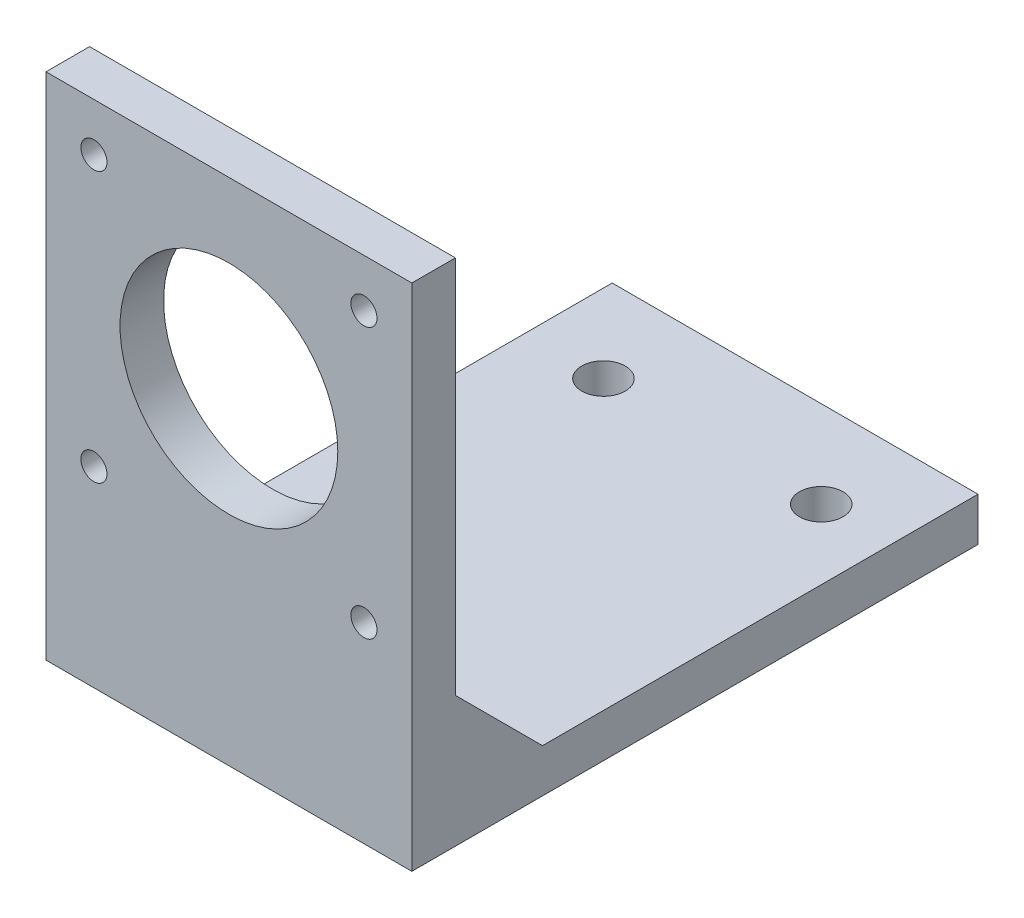
ISO-10303-21;
HEADER;
FILE_DESCRIPTION(('STEP AP214'),'2;1');
FILE_NAME('part.step','',(''),(''),'','','');
FILE_SCHEMA(('AUTOMOTIVE_DESIGN { 1 0 10303 214 1 1 1 1 }'));
ENDSEC;
DATA;
#1=APPLICATION_CONTEXT('core data for automotive mechanical design processes');
#2=APPLICATION_PROTOCOL_DEFINITION('international standard','automotive_design',2000,#1);
#3=PRODUCT_CONTEXT('',#1,'mechanical');
#4=PRODUCT('Part','Part','',(#3));
#5=PRODUCT_RELATED_PRODUCT_CATEGORY('part','',(#4));
#6=PRODUCT_DEFINITION_FORMATION('','',#4);
#7=PRODUCT_DEFINITION_CONTEXT('part definition',#1,'design');
#8=PRODUCT_DEFINITION('design','',#6,#7);
#9=PRODUCT_DEFINITION_SHAPE('','',#8);
#10=(LENGTH_UNIT() NAMED_UNIT(*) SI_UNIT(.MILLI.,.METRE.));
#11=(NAMED_UNIT(*) PLANE_ANGLE_UNIT() SI_UNIT($,.RADIAN.));
#12=(NAMED_UNIT(*) SI_UNIT($,.STERADIAN.) SOLID_ANGLE_UNIT());
#13=UNCERTAINTY_MEASURE_WITH_UNIT(LENGTH_MEASURE(1.E-05),#10,'distance_accuracy_value','');
#14=(GEOMETRIC_REPRESENTATION_CONTEXT(3) GLOBAL_UNCERTAINTY_ASSIGNED_CONTEXT((#13)) GLOBAL_UNIT_ASSIGNED_CONTEXT((#10,
#11,#12)) REPRESENTATION_CONTEXT('',''));
#15=CARTESIAN_POINT('',(0.,0.,0.));
#16=DIRECTION('',(0.,0.,1.));
#17=DIRECTION('',(1.,0.,0.));
#18=AXIS2_PLACEMENT_3D('',#15,#16,#17);
#19=CARTESIAN_POINT('',(0.,5.,0.));
#20=DIRECTION('',(0.,1.,0.));
#21=DIRECTION('',(0.,0.,1.));
#22=AXIS2_PLACEMENT_3D('',#19,#20,#21);
#23=PLANE('',#22);
#24=DIRECTION('',(1.,0.,0.));
#25=VECTOR('',#24,1.);
#26=CARTESIAN_POINT('',(-42.,5.,50.));
#27=LINE('',#26,#25);
#28=CARTESIAN_POINT('',(-42.,5.,50.));
#29=VERTEX_POINT('',#28);
#30=CARTESIAN_POINT('',(-37.,5.,50.));
#31=VERTEX_POINT('',#30);
#32=EDGE_CURVE('E55',#29,#31,#27,.T.);
#33=ORIENTED_EDGE('',*,*,#32,.T.);
#34=DIRECTION('',(0.,0.,-1.));
#35=VECTOR('',#34,1.);
#36=CARTESIAN_POINT('',(-37.,5.,60.));
#37=LINE('',#36,#35);
#38=CARTESIAN_POINT('',(-37.,5.,60.));
#39=VERTEX_POINT('',#38);
#40=EDGE_CURVE('E129',#39,#31,#37,.T.);
#41=ORIENTED_EDGE('',*,*,#40,.F.);
#42=DIRECTION('',(1.,0.,0.));
#43=VECTOR('',#42,1.);
#44=CARTESIAN_POINT('',(0.,5.,60.));
#45=LINE('',#44,#43);
#46=CARTESIAN_POINT('',(-5.,5.,60.));
#47=VERTEX_POINT('',#46);
#48=EDGE_CURVE('E115',#39,#47,#45,.T.);
#49=ORIENTED_EDGE('',*,*,#48,.T.);
#50=DIRECTION('',(0.,0.,-1.));
#51=VECTOR('',#50,1.);
#52=CARTESIAN_POINT('',(-5.,5.,60.));
#53=LINE('',#52,#51);
#54=CARTESIAN_POINT('',(-5.,5.,50.));
#55=VERTEX_POINT('',#54);
#56=EDGE_CURVE('E156',#47,#55,#53,.T.);
#57=ORIENTED_EDGE('',*,*,#56,.T.);
#58=DIRECTION('',(1.,0.,0.));
#59=VECTOR('',#58,1.);
#60=CARTESIAN_POINT('',(-5.,5.,50.));
#61=LINE('',#60,#59);
#62=CARTESIAN_POINT('',(0.,5.,50.));
#63=VERTEX_POINT('',#62);
#64=EDGE_CURVE('E162',#55,#63,#61,.T.);
#65=ORIENTED_EDGE('',*,*,#64,.T.);
#66=DIRECTION('',(0.,0.,-1.));
#67=VECTOR('',#66,1.);
#68=CARTESIAN_POINT('',(0.,5.,0.));
#69=LINE('',#68,#67);
#70=CARTESIAN_POINT('',(0.,5.,0.));
#71=VERTEX_POINT('',#70);
#72=EDGE_CURVE('E126',#63,#71,#69,.T.);
#73=ORIENTED_EDGE('',*,*,#72,.T.);
#74=DIRECTION('',(-1.,0.,0.));
#75=VECTOR('',#74,1.);
#76=CARTESIAN_POINT('',(0.,5.,0.));
#77=LINE('',#76,#75);
#78=CARTESIAN_POINT('',(-42.,5.,0.));
#79=VERTEX_POINT('',#78);
#80=EDGE_CURVE('E258',#71,#79,#77,.T.);
#81=ORIENTED_EDGE('',*,*,#80,.T.);
#82=DIRECTION('',(0.,0.,1.));
#83=VECTOR('',#82,1.);
#84=CARTESIAN_POINT('',(-42.,5.,0.));
#85=LINE('',#84,#83);
#86=EDGE_CURVE('E60',#79,#29,#85,.T.);
#87=ORIENTED_EDGE('',*,*,#86,.T.);
#88=EDGE_LOOP('',(#33,#41,#49,#57,#65,#73,#81,#87));
#89=FACE_BOUND('',#88,.T.);
#90=CARTESIAN_POINT('',(-33.,5.,10.));
#91=DIRECTION('',(0.,1.,0.));
#92=DIRECTION('',(0.,0.,1.));
#93=AXIS2_PLACEMENT_3D('',#90,#91,#92);
#94=CIRCLE('',#93,2.5);
#95=CARTESIAN_POINT('',(-33.,5.,12.5));
#96=VERTEX_POINT('',#95);
#97=EDGE_CURVE('E250',#96,#96,#94,.T.);
#98=ORIENTED_EDGE('',*,*,#97,.F.);
#99=EDGE_LOOP('',(#98));
#100=FACE_BOUND('',#99,.T.);
#101=CARTESIAN_POINT('',(-8.,5.,10.));
#102=DIRECTION('',(0.,1.,0.));
#103=DIRECTION('',(0.,0.,1.));
#104=AXIS2_PLACEMENT_3D('',#101,#102,#103);
#105=CIRCLE('',#104,2.5);
#106=CARTESIAN_POINT('',(-8.,5.,12.5));
#107=VERTEX_POINT('',#106);
#108=EDGE_CURVE('E242',#107,#107,#105,.T.);
#109=ORIENTED_EDGE('',*,*,#108,.F.);
#110=EDGE_LOOP('',(#109));
#111=FACE_BOUND('',#110,.T.);
#112=ADVANCED_FACE('F39',(#89,#100,#111),#23,.T.);
#113=CARTESIAN_POINT('',(0.,0.,0.));
#114=DIRECTION('',(0.,1.,0.));
#115=DIRECTION('',(0.,0.,1.));
#116=AXIS2_PLACEMENT_3D('',#113,#114,#115);
#117=PLANE('',#116);
#118=DIRECTION('',(-1.,0.,0.));
#119=VECTOR('',#118,1.);
#120=CARTESIAN_POINT('',(0.,0.,0.));
#121=LINE('',#120,#119);
#122=CARTESIAN_POINT('',(0.,0.,0.));
#123=VERTEX_POINT('',#122);
#124=CARTESIAN_POINT('',(-42.,0.,0.));
#125=VERTEX_POINT('',#124);
#126=EDGE_CURVE('E254',#123,#125,#121,.T.);
#127=ORIENTED_EDGE('',*,*,#126,.F.);
#128=DIRECTION('',(0.,0.,-1.));
#129=VECTOR('',#128,1.);
#130=CARTESIAN_POINT('',(0.,0.,0.));
#131=LINE('',#130,#129);
#132=CARTESIAN_POINT('',(0.,0.,65.));
#133=VERTEX_POINT('',#132);
#134=EDGE_CURVE('E261',#133,#123,#131,.T.);
#135=ORIENTED_EDGE('',*,*,#134,.F.);
#136=DIRECTION('',(1.,0.,0.));
#137=VECTOR('',#136,1.);
#138=CARTESIAN_POINT('',(-42.,0.,65.));
#139=LINE('',#138,#137);
#140=CARTESIAN_POINT('',(-42.,0.,65.));
#141=VERTEX_POINT('',#140);
#142=EDGE_CURVE('E214',#141,#133,#139,.T.);
#143=ORIENTED_EDGE('',*,*,#142,.F.);
#144=DIRECTION('',(0.,0.,1.));
#145=VECTOR('',#144,1.);
#146=CARTESIAN_POINT('',(-42.,0.,0.));
#147=LINE('',#146,#145);
#148=EDGE_CURVE('E269',#125,#141,#147,.T.);
#149=ORIENTED_EDGE('',*,*,#148,.F.);
#150=EDGE_LOOP('',(#127,#135,#143,#149));
#151=FACE_BOUND('',#150,.T.);
#152=CARTESIAN_POINT('',(-33.,0.,10.));
#153=DIRECTION('',(0.,1.,0.));
#154=DIRECTION('',(0.,0.,1.));
#155=AXIS2_PLACEMENT_3D('',#152,#153,#154);
#156=CIRCLE('',#155,2.5);
#157=CARTESIAN_POINT('',(-33.,0.,12.5));
#158=VERTEX_POINT('',#157);
#159=EDGE_CURVE('E246',#158,#158,#156,.T.);
#160=ORIENTED_EDGE('',*,*,#159,.T.);
#161=EDGE_LOOP('',(#160));
#162=FACE_BOUND('',#161,.T.);
#163=CARTESIAN_POINT('',(-8.,0.,10.));
#164=DIRECTION('',(0.,1.,0.));
#165=DIRECTION('',(0.,0.,1.));
#166=AXIS2_PLACEMENT_3D('',#163,#164,#165);
#167=CIRCLE('',#166,2.5);
#168=CARTESIAN_POINT('',(-8.,0.,12.5));
#169=VERTEX_POINT('',#168);
#170=EDGE_CURVE('E241',#169,#169,#167,.T.);
#171=ORIENTED_EDGE('',*,*,#170,.T.);
#172=EDGE_LOOP('',(#171));
#173=FACE_BOUND('',#172,.T.);
#174=ADVANCED_FACE('F283',(#151,#162,#173),#117,.F.);
#175=CARTESIAN_POINT('',(0.,5.,0.));
#176=DIRECTION('',(0.,0.,1.));
#177=DIRECTION('',(1.,0.,0.));
#178=AXIS2_PLACEMENT_3D('',#175,#176,#177);
#179=PLANE('',#178);
#180=ORIENTED_EDGE('',*,*,#126,.T.);
#181=DIRECTION('',(0.,-1.,0.));
#182=VECTOR('',#181,1.);
#183=CARTESIAN_POINT('',(-42.,5.,0.));
#184=LINE('',#183,#182);
#185=EDGE_CURVE('E11',#79,#125,#184,.T.);
#186=ORIENTED_EDGE('',*,*,#185,.F.);
#187=ORIENTED_EDGE('',*,*,#80,.F.);
#188=DIRECTION('',(0.,-1.,0.));
#189=VECTOR('',#188,1.);
#190=CARTESIAN_POINT('',(0.,5.,0.));
#191=LINE('',#190,#189);
#192=EDGE_CURVE('E48',#71,#123,#191,.T.);
#193=ORIENTED_EDGE('',*,*,#192,.T.);
#194=EDGE_LOOP('',(#180,#186,#187,#193));
#195=FACE_BOUND('',#194,.T.);
#196=ADVANCED_FACE('F41',(#195),#179,.F.);
#197=CARTESIAN_POINT('',(-42.,5.,0.));
#198=DIRECTION('',(1.,0.,0.));
#199=DIRECTION('',(0.,0.,-1.));
#200=AXIS2_PLACEMENT_3D('',#197,#198,#199);
#201=PLANE('',#200);
#202=DIRECTION('',(0.,0.707106781186548,0.707106781186547));
#203=VECTOR('',#202,1.);
#204=CARTESIAN_POINT('',(-42.,5.,50.));
#205=LINE('',#204,#203);
#206=CARTESIAN_POINT('',(-42.,15.,60.));
#207=VERTEX_POINT('',#206);
#208=EDGE_CURVE('E134',#29,#207,#205,.T.);
#209=ORIENTED_EDGE('',*,*,#208,.F.);
#210=ORIENTED_EDGE('',*,*,#86,.F.);
#211=ORIENTED_EDGE('',*,*,#185,.T.);
#212=ORIENTED_EDGE('',*,*,#148,.T.);
#213=DIRECTION('',(0.,-1.,0.));
#214=VECTOR('',#213,1.);
#215=CARTESIAN_POINT('',(-42.,0.,65.));
#216=LINE('',#215,#214);
#217=CARTESIAN_POINT('',(-42.,58.5,65.));
#218=VERTEX_POINT('',#217);
#219=EDGE_CURVE('E210',#218,#141,#216,.T.);
#220=ORIENTED_EDGE('',*,*,#219,.F.);
#221=DIRECTION('',(0.,0.,-1.));
#222=VECTOR('',#221,1.);
#223=CARTESIAN_POINT('',(-42.,58.5,65.));
#224=LINE('',#223,#222);
#225=CARTESIAN_POINT('',(-42.,58.5,60.));
#226=VERTEX_POINT('',#225);
#227=EDGE_CURVE('E225',#218,#226,#224,.T.);
#228=ORIENTED_EDGE('',*,*,#227,.T.);
#229=DIRECTION('',(0.,-1.,0.));
#230=VECTOR('',#229,1.);
#231=CARTESIAN_POINT('',(-42.,0.,60.));
#232=LINE('',#231,#230);
#233=EDGE_CURVE('E206',#226,#207,#232,.T.);
#234=ORIENTED_EDGE('',*,*,#233,.T.);
#235=EDGE_LOOP('',(#209,#210,#211,#212,#220,#228,#234));
#236=FACE_BOUND('',#235,.T.);
#237=ADVANCED_FACE('F289',(#236),#201,.F.);
#238=CARTESIAN_POINT('',(0.,5.,0.));
#239=DIRECTION('',(-1.,0.,0.));
#240=DIRECTION('',(0.,0.,1.));
#241=AXIS2_PLACEMENT_3D('',#238,#239,#240);
#242=PLANE('',#241);
#243=ORIENTED_EDGE('',*,*,#72,.F.);
#244=DIRECTION('',(0.,0.707106781186548,0.707106781186547));
#245=VECTOR('',#244,1.);
#246=CARTESIAN_POINT('',(0.,5.,50.));
#247=LINE('',#246,#245);
#248=CARTESIAN_POINT('',(0.,15.,60.));
#249=VERTEX_POINT('',#248);
#250=EDGE_CURVE('E146',#63,#249,#247,.T.);
#251=ORIENTED_EDGE('',*,*,#250,.T.);
#252=DIRECTION('',(0.,1.,0.));
#253=VECTOR('',#252,1.);
#254=CARTESIAN_POINT('',(0.,0.,60.));
#255=LINE('',#254,#253);
#256=CARTESIAN_POINT('',(0.,58.5,60.));
#257=VERTEX_POINT('',#256);
#258=EDGE_CURVE('E229',#249,#257,#255,.T.);
#259=ORIENTED_EDGE('',*,*,#258,.T.);
#260=DIRECTION('',(0.,0.,-1.));
#261=VECTOR('',#260,1.);
#262=CARTESIAN_POINT('',(0.,58.5,65.));
#263=LINE('',#262,#261);
#264=CARTESIAN_POINT('',(0.,58.5,65.));
#265=VERTEX_POINT('',#264);
#266=EDGE_CURVE('E237',#265,#257,#263,.T.);
#267=ORIENTED_EDGE('',*,*,#266,.F.);
#268=DIRECTION('',(0.,1.,0.));
#269=VECTOR('',#268,1.);
#270=CARTESIAN_POINT('',(0.,0.,65.));
#271=LINE('',#270,#269);
#272=EDGE_CURVE('E219',#133,#265,#271,.T.);
#273=ORIENTED_EDGE('',*,*,#272,.F.);
#274=ORIENTED_EDGE('',*,*,#134,.T.);
#275=ORIENTED_EDGE('',*,*,#192,.F.);
#276=EDGE_LOOP('',(#243,#251,#259,#267,#273,#274,#275));
#277=FACE_BOUND('',#276,.T.);
#278=ADVANCED_FACE('F291',(#277),#242,.F.);
#279=CARTESIAN_POINT('',(-33.,5.,10.));
#280=DIRECTION('',(0.,-1.,0.));
#281=DIRECTION('',(0.,0.,-1.));
#282=AXIS2_PLACEMENT_3D('',#279,#280,#281);
#283=CYLINDRICAL_SURFACE('',#282,2.5);
#284=ORIENTED_EDGE('',*,*,#97,.T.);
#285=EDGE_LOOP('',(#284));
#286=FACE_BOUND('',#285,.T.);
#287=ORIENTED_EDGE('',*,*,#159,.F.);
#288=EDGE_LOOP('',(#287));
#289=FACE_BOUND('',#288,.T.);
#290=ADVANCED_FACE('F356',(#286,#289),#283,.F.);
#291=CARTESIAN_POINT('',(-8.,5.,10.));
#292=DIRECTION('',(0.,-1.,0.));
#293=DIRECTION('',(0.,0.,-1.));
#294=AXIS2_PLACEMENT_3D('',#291,#292,#293);
#295=CYLINDRICAL_SURFACE('',#294,2.5);
#296=ORIENTED_EDGE('',*,*,#108,.T.);
#297=EDGE_LOOP('',(#296));
#298=FACE_BOUND('',#297,.T.);
#299=ORIENTED_EDGE('',*,*,#170,.F.);
#300=EDGE_LOOP('',(#299));
#301=FACE_BOUND('',#300,.T.);
#302=ADVANCED_FACE('F327',(#298,#301),#295,.F.);
#303=CARTESIAN_POINT('',(0.,0.,60.));
#304=DIRECTION('',(0.,0.,-1.));
#305=DIRECTION('',(-1.,0.,0.));
#306=AXIS2_PLACEMENT_3D('',#303,#304,#305);
#307=PLANE('',#306);
#308=DIRECTION('',(1.,0.,0.));
#309=VECTOR('',#308,1.);
#310=CARTESIAN_POINT('',(-42.,15.,60.));
#311=LINE('',#310,#309);
#312=CARTESIAN_POINT('',(-37.,15.,60.));
#313=VERTEX_POINT('',#312);
#314=EDGE_CURVE('E147',#207,#313,#311,.T.);
#315=ORIENTED_EDGE('',*,*,#314,.F.);
#316=ORIENTED_EDGE('',*,*,#233,.F.);
#317=DIRECTION('',(-1.,0.,0.));
#318=VECTOR('',#317,1.);
#319=CARTESIAN_POINT('',(-42.,58.5,60.));
#320=LINE('',#319,#318);
#321=EDGE_CURVE('E215',#257,#226,#320,.T.);
#322=ORIENTED_EDGE('',*,*,#321,.F.);
#323=ORIENTED_EDGE('',*,*,#258,.F.);
#324=DIRECTION('',(1.,0.,0.));
#325=VECTOR('',#324,1.);
#326=CARTESIAN_POINT('',(-5.,15.,60.));
#327=LINE('',#326,#325);
#328=CARTESIAN_POINT('',(-5.,15.,60.));
#329=VERTEX_POINT('',#328);
#330=EDGE_CURVE('E159',#329,#249,#327,.T.);
#331=ORIENTED_EDGE('',*,*,#330,.F.);
#332=DIRECTION('',(0.,-1.,0.));
#333=VECTOR('',#332,1.);
#334=CARTESIAN_POINT('',(-5.,15.,60.));
#335=LINE('',#334,#333);
#336=EDGE_CURVE('E122',#329,#47,#335,.T.);
#337=ORIENTED_EDGE('',*,*,#336,.T.);
#338=ORIENTED_EDGE('',*,*,#48,.F.);
#339=DIRECTION('',(0.,-1.,0.));
#340=VECTOR('',#339,1.);
#341=CARTESIAN_POINT('',(-37.,15.,60.));
#342=LINE('',#341,#340);
#343=EDGE_CURVE('E119',#313,#39,#342,.T.);
#344=ORIENTED_EDGE('',*,*,#343,.F.);
#345=EDGE_LOOP('',(#315,#316,#322,#323,#331,#337,#338,#344));
#346=FACE_BOUND('',#345,.T.);
#347=CARTESIAN_POINT('',(-5.49999999999999,22.,60.));
#348=DIRECTION('',(0.,0.,1.));
#349=DIRECTION('',(1.,0.,0.));
#350=AXIS2_PLACEMENT_3D('',#347,#348,#349);
#351=CIRCLE('',#350,1.5);
#352=CARTESIAN_POINT('',(-3.99999999999999,22.,60.));
#353=VERTEX_POINT('',#352);
#354=EDGE_CURVE('E166',#353,#353,#351,.T.);
#355=ORIENTED_EDGE('',*,*,#354,.T.);
#356=EDGE_LOOP('',(#355));
#357=FACE_BOUND('',#356,.T.);
#358=CARTESIAN_POINT('',(-36.5,22.,60.));
#359=DIRECTION('',(0.,0.,1.));
#360=DIRECTION('',(1.,0.,0.));
#361=AXIS2_PLACEMENT_3D('',#358,#359,#360);
#362=CIRCLE('',#361,1.5);
#363=CARTESIAN_POINT('',(-35.,22.,60.));
#364=VERTEX_POINT('',#363);
#365=EDGE_CURVE('E182',#364,#364,#362,.T.);
#366=ORIENTED_EDGE('',*,*,#365,.T.);
#367=EDGE_LOOP('',(#366));
#368=FACE_BOUND('',#367,.T.);
#369=CARTESIAN_POINT('',(-21.,37.5,60.));
#370=DIRECTION('',(0.,0.,1.));
#371=DIRECTION('',(1.,0.,0.));
#372=AXIS2_PLACEMENT_3D('',#369,#370,#371);
#373=CIRCLE('',#372,12.5);
#374=CARTESIAN_POINT('',(-8.49999999999999,37.5,60.));
#375=VERTEX_POINT('',#374);
#376=EDGE_CURVE('E198',#375,#375,#373,.T.);
#377=ORIENTED_EDGE('',*,*,#376,.T.);
#378=EDGE_LOOP('',(#377));
#379=FACE_BOUND('',#378,.T.);
#380=CARTESIAN_POINT('',(-36.5,53.,60.));
#381=DIRECTION('',(0.,0.,1.));
#382=DIRECTION('',(1.,0.,0.));
#383=AXIS2_PLACEMENT_3D('',#380,#381,#382);
#384=CIRCLE('',#383,1.5);
#385=CARTESIAN_POINT('',(-35.,53.,60.));
#386=VERTEX_POINT('',#385);
#387=EDGE_CURVE('E190',#386,#386,#384,.T.);
#388=ORIENTED_EDGE('',*,*,#387,.T.);
#389=EDGE_LOOP('',(#388));
#390=FACE_BOUND('',#389,.T.);
#391=CARTESIAN_POINT('',(-5.49999999999999,53.,60.));
#392=DIRECTION('',(0.,0.,1.));
#393=DIRECTION('',(1.,0.,0.));
#394=AXIS2_PLACEMENT_3D('',#391,#392,#393);
#395=CIRCLE('',#394,1.5);
#396=CARTESIAN_POINT('',(-3.99999999999999,53.,60.));
#397=VERTEX_POINT('',#396);
#398=EDGE_CURVE('E174',#397,#397,#395,.T.);
#399=ORIENTED_EDGE('',*,*,#398,.T.);
#400=EDGE_LOOP('',(#399));
#401=FACE_BOUND('',#400,.T.);
#402=ADVANCED_FACE('F116',(#346,#357,#368,#379,#390,#401),#307,.T.);
#403=CARTESIAN_POINT('',(0.,0.,65.));
#404=DIRECTION('',(0.,0.,-1.));
#405=DIRECTION('',(-1.,0.,0.));
#406=AXIS2_PLACEMENT_3D('',#403,#404,#405);
#407=PLANE('',#406);
#408=ORIENTED_EDGE('',*,*,#219,.T.);
#409=ORIENTED_EDGE('',*,*,#142,.T.);
#410=ORIENTED_EDGE('',*,*,#272,.T.);
#411=DIRECTION('',(-1.,0.,0.));
#412=VECTOR('',#411,1.);
#413=CARTESIAN_POINT('',(-42.,58.5,65.));
#414=LINE('',#413,#412);
#415=EDGE_CURVE('E222',#265,#218,#414,.T.);
#416=ORIENTED_EDGE('',*,*,#415,.T.);
#417=EDGE_LOOP('',(#408,#409,#410,#416));
#418=FACE_BOUND('',#417,.T.);
#419=CARTESIAN_POINT('',(-21.,37.5,65.));
#420=DIRECTION('',(0.,0.,1.));
#421=DIRECTION('',(1.,0.,0.));
#422=AXIS2_PLACEMENT_3D('',#419,#420,#421);
#423=CIRCLE('',#422,12.5);
#424=CARTESIAN_POINT('',(-8.49999999999999,37.5,65.));
#425=VERTEX_POINT('',#424);
#426=EDGE_CURVE('E202',#425,#425,#423,.T.);
#427=ORIENTED_EDGE('',*,*,#426,.F.);
#428=EDGE_LOOP('',(#427));
#429=FACE_BOUND('',#428,.T.);
#430=CARTESIAN_POINT('',(-36.5,53.,65.));
#431=DIRECTION('',(0.,0.,1.));
#432=DIRECTION('',(1.,0.,0.));
#433=AXIS2_PLACEMENT_3D('',#430,#431,#432);
#434=CIRCLE('',#433,1.5);
#435=CARTESIAN_POINT('',(-35.,53.,65.));
#436=VERTEX_POINT('',#435);
#437=EDGE_CURVE('E194',#436,#436,#434,.T.);
#438=ORIENTED_EDGE('',*,*,#437,.F.);
#439=EDGE_LOOP('',(#438));
#440=FACE_BOUND('',#439,.T.);
#441=CARTESIAN_POINT('',(-36.5,22.,65.));
#442=DIRECTION('',(0.,0.,1.));
#443=DIRECTION('',(1.,0.,0.));
#444=AXIS2_PLACEMENT_3D('',#441,#442,#443);
#445=CIRCLE('',#444,1.5);
#446=CARTESIAN_POINT('',(-35.,22.,65.));
#447=VERTEX_POINT('',#446);
#448=EDGE_CURVE('E186',#447,#447,#445,.T.);
#449=ORIENTED_EDGE('',*,*,#448,.F.);
#450=EDGE_LOOP('',(#449));
#451=FACE_BOUND('',#450,.T.);
#452=CARTESIAN_POINT('',(-5.49999999999999,53.,65.));
#453=DIRECTION('',(0.,0.,1.));
#454=DIRECTION('',(1.,0.,0.));
#455=AXIS2_PLACEMENT_3D('',#452,#453,#454);
#456=CIRCLE('',#455,1.5);
#457=CARTESIAN_POINT('',(-3.99999999999999,53.,65.));
#458=VERTEX_POINT('',#457);
#459=EDGE_CURVE('E178',#458,#458,#456,.T.);
#460=ORIENTED_EDGE('',*,*,#459,.F.);
#461=EDGE_LOOP('',(#460));
#462=FACE_BOUND('',#461,.T.);
#463=CARTESIAN_POINT('',(-5.49999999999999,22.,65.));
#464=DIRECTION('',(0.,0.,1.));
#465=DIRECTION('',(1.,0.,0.));
#466=AXIS2_PLACEMENT_3D('',#463,#464,#465);
#467=CIRCLE('',#466,1.5);
#468=CARTESIAN_POINT('',(-3.99999999999999,22.,65.));
#469=VERTEX_POINT('',#468);
#470=EDGE_CURVE('E170',#469,#469,#467,.T.);
#471=ORIENTED_EDGE('',*,*,#470,.F.);
#472=EDGE_LOOP('',(#471));
#473=FACE_BOUND('',#472,.T.);
#474=ADVANCED_FACE('F304',(#418,#429,#440,#451,#462,#473),#407,.F.);
#475=CARTESIAN_POINT('',(-42.,58.5,65.));
#476=DIRECTION('',(0.,-1.,0.));
#477=DIRECTION('',(0.,0.,-1.));
#478=AXIS2_PLACEMENT_3D('',#475,#476,#477);
#479=PLANE('',#478);
#480=ORIENTED_EDGE('',*,*,#321,.T.);
#481=ORIENTED_EDGE('',*,*,#227,.F.);
#482=ORIENTED_EDGE('',*,*,#415,.F.);
#483=ORIENTED_EDGE('',*,*,#266,.T.);
#484=EDGE_LOOP('',(#480,#481,#482,#483));
#485=FACE_BOUND('',#484,.T.);
#486=ADVANCED_FACE('F301',(#485),#479,.F.);
#487=CARTESIAN_POINT('',(-21.,37.5,65.));
#488=DIRECTION('',(0.,0.,-1.));
#489=DIRECTION('',(-1.,0.,0.));
#490=AXIS2_PLACEMENT_3D('',#487,#488,#489);
#491=CYLINDRICAL_SURFACE('',#490,12.5);
#492=ORIENTED_EDGE('',*,*,#426,.T.);
#493=EDGE_LOOP('',(#492));
#494=FACE_BOUND('',#493,.T.);
#495=ORIENTED_EDGE('',*,*,#376,.F.);
#496=EDGE_LOOP('',(#495));
#497=FACE_BOUND('',#496,.T.);
#498=ADVANCED_FACE('F397',(#494,#497),#491,.F.);
#499=CARTESIAN_POINT('',(-36.5,53.,65.));
#500=DIRECTION('',(0.,0.,-1.));
#501=DIRECTION('',(-1.,0.,0.));
#502=AXIS2_PLACEMENT_3D('',#499,#500,#501);
#503=CYLINDRICAL_SURFACE('',#502,1.5);
#504=ORIENTED_EDGE('',*,*,#437,.T.);
#505=EDGE_LOOP('',(#504));
#506=FACE_BOUND('',#505,.T.);
#507=ORIENTED_EDGE('',*,*,#387,.F.);
#508=EDGE_LOOP('',(#507));
#509=FACE_BOUND('',#508,.T.);
#510=ADVANCED_FACE('F344',(#506,#509),#503,.F.);
#511=CARTESIAN_POINT('',(-36.5,22.,65.));
#512=DIRECTION('',(0.,0.,-1.));
#513=DIRECTION('',(-1.,0.,0.));
#514=AXIS2_PLACEMENT_3D('',#511,#512,#513);
#515=CYLINDRICAL_SURFACE('',#514,1.5);
#516=ORIENTED_EDGE('',*,*,#448,.T.);
#517=EDGE_LOOP('',(#516));
#518=FACE_BOUND('',#517,.T.);
#519=ORIENTED_EDGE('',*,*,#365,.F.);
#520=EDGE_LOOP('',(#519));
#521=FACE_BOUND('',#520,.T.);
#522=ADVANCED_FACE('F338',(#518,#521),#515,.F.);
#523=CARTESIAN_POINT('',(-5.49999999999999,53.,65.));
#524=DIRECTION('',(0.,0.,-1.));
#525=DIRECTION('',(-1.,0.,0.));
#526=AXIS2_PLACEMENT_3D('',#523,#524,#525);
#527=CYLINDRICAL_SURFACE('',#526,1.5);
#528=ORIENTED_EDGE('',*,*,#459,.T.);
#529=EDGE_LOOP('',(#528));
#530=FACE_BOUND('',#529,.T.);
#531=ORIENTED_EDGE('',*,*,#398,.F.);
#532=EDGE_LOOP('',(#531));
#533=FACE_BOUND('',#532,.T.);
#534=ADVANCED_FACE('F322',(#530,#533),#527,.F.);
#535=CARTESIAN_POINT('',(-5.49999999999999,22.,65.));
#536=DIRECTION('',(0.,0.,-1.));
#537=DIRECTION('',(-1.,0.,0.));
#538=AXIS2_PLACEMENT_3D('',#535,#536,#537);
#539=CYLINDRICAL_SURFACE('',#538,1.5);
#540=ORIENTED_EDGE('',*,*,#470,.T.);
#541=EDGE_LOOP('',(#540));
#542=FACE_BOUND('',#541,.T.);
#543=ORIENTED_EDGE('',*,*,#354,.F.);
#544=EDGE_LOOP('',(#543));
#545=FACE_BOUND('',#544,.T.);
#546=ADVANCED_FACE('F319',(#542,#545),#539,.F.);
#547=CARTESIAN_POINT('',(-5.,5.,50.));
#548=DIRECTION('',(0.,0.707106781186547,-0.707106781186548));
#549=DIRECTION('',(0.,0.707106781186548,0.707106781186547));
#550=AXIS2_PLACEMENT_3D('',#547,#548,#549);
#551=PLANE('',#550);
#552=ORIENTED_EDGE('',*,*,#250,.F.);
#553=ORIENTED_EDGE('',*,*,#64,.F.);
#554=DIRECTION('',(0.,0.707106781186548,0.707106781186547));
#555=VECTOR('',#554,1.);
#556=CARTESIAN_POINT('',(-5.,5.,50.));
#557=LINE('',#556,#555);
#558=EDGE_CURVE('E150',#55,#329,#557,.T.);
#559=ORIENTED_EDGE('',*,*,#558,.T.);
#560=ORIENTED_EDGE('',*,*,#330,.T.);
#561=EDGE_LOOP('',(#552,#553,#559,#560));
#562=FACE_BOUND('',#561,.T.);
#563=ADVANCED_FACE('F295',(#562),#551,.T.);
#564=CARTESIAN_POINT('',(-5.,0.,0.));
#565=DIRECTION('',(1.,0.,0.));
#566=DIRECTION('',(0.,0.,-1.));
#567=AXIS2_PLACEMENT_3D('',#564,#565,#566);
#568=PLANE('',#567);
#569=ORIENTED_EDGE('',*,*,#558,.F.);
#570=ORIENTED_EDGE('',*,*,#56,.F.);
#571=ORIENTED_EDGE('',*,*,#336,.F.);
#572=EDGE_LOOP('',(#569,#570,#571));
#573=FACE_BOUND('',#572,.T.);
#574=ADVANCED_FACE('F440',(#573),#568,.F.);
#575=CARTESIAN_POINT('',(-42.,5.,50.));
#576=DIRECTION('',(0.,0.707106781186547,-0.707106781186548));
#577=DIRECTION('',(0.,0.707106781186548,0.707106781186547));
#578=AXIS2_PLACEMENT_3D('',#575,#576,#577);
#579=PLANE('',#578);
#580=DIRECTION('',(0.,0.707106781186548,0.707106781186547));
#581=VECTOR('',#580,1.);
#582=CARTESIAN_POINT('',(-37.,5.,50.));
#583=LINE('',#582,#581);
#584=EDGE_CURVE('E137',#31,#313,#583,.T.);
#585=ORIENTED_EDGE('',*,*,#584,.F.);
#586=ORIENTED_EDGE('',*,*,#32,.F.);
#587=ORIENTED_EDGE('',*,*,#208,.T.);
#588=ORIENTED_EDGE('',*,*,#314,.T.);
#589=EDGE_LOOP('',(#585,#586,#587,#588));
#590=FACE_BOUND('',#589,.T.);
#591=ADVANCED_FACE('F448',(#590),#579,.T.);
#592=CARTESIAN_POINT('',(-37.,0.,0.));
#593=DIRECTION('',(1.,0.,0.));
#594=DIRECTION('',(0.,0.,-1.));
#595=AXIS2_PLACEMENT_3D('',#592,#593,#594);
#596=PLANE('',#595);
#597=ORIENTED_EDGE('',*,*,#584,.T.);
#598=ORIENTED_EDGE('',*,*,#343,.T.);
#599=ORIENTED_EDGE('',*,*,#40,.T.);
#600=EDGE_LOOP('',(#597,#598,#599));
#601=FACE_BOUND('',#600,.T.);
#602=ADVANCED_FACE('F136',(#601),#596,.T.);
#603=CLOSED_SHELL('',(#112,#174,#196,#237,#278,#290,#302,#402,#474,#486,#498,#510,#522,#534,
#546,#563,#574,#591,#602));
#604=MANIFOLD_SOLID_BREP('B2',#603);
#605=ADVANCED_BREP_SHAPE_REPRESENTATION('',(#18,#604),#14);
#606=SHAPE_DEFINITION_REPRESENTATION(#9,#605);
ENDSEC;
END-ISO-10303-21;
